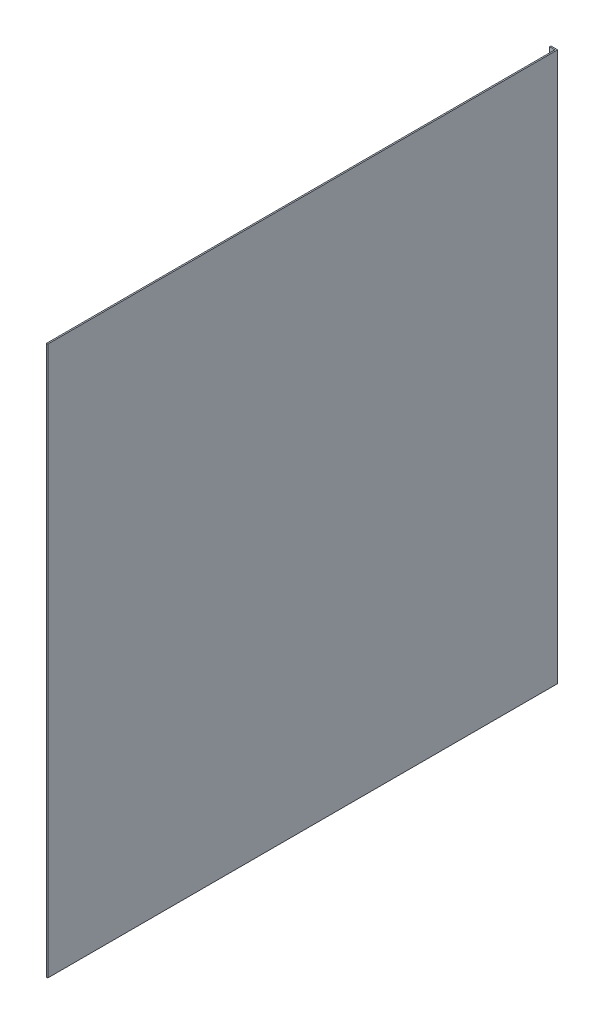
ISO-10303-21;
HEADER;
FILE_DESCRIPTION(('STEP AP214'),'2;1');
FILE_NAME('part.step','',(''),(''),'','','');
FILE_SCHEMA(('AUTOMOTIVE_DESIGN { 1 0 10303 214 1 1 1 1 }'));
ENDSEC;
DATA;
#1=APPLICATION_CONTEXT('core data for automotive mechanical design processes');
#2=APPLICATION_PROTOCOL_DEFINITION('international standard','automotive_design',2000,#1);
#3=PRODUCT_CONTEXT('',#1,'mechanical');
#4=PRODUCT('Part','Part','',(#3));
#5=PRODUCT_RELATED_PRODUCT_CATEGORY('part','',(#4));
#6=PRODUCT_DEFINITION_FORMATION('','',#4);
#7=PRODUCT_DEFINITION_CONTEXT('part definition',#1,'design');
#8=PRODUCT_DEFINITION('design','',#6,#7);
#9=PRODUCT_DEFINITION_SHAPE('','',#8);
#10=(LENGTH_UNIT() NAMED_UNIT(*) SI_UNIT(.MILLI.,.METRE.));
#11=(NAMED_UNIT(*) PLANE_ANGLE_UNIT() SI_UNIT($,.RADIAN.));
#12=(NAMED_UNIT(*) SI_UNIT($,.STERADIAN.) SOLID_ANGLE_UNIT());
#13=UNCERTAINTY_MEASURE_WITH_UNIT(LENGTH_MEASURE(1.E-05),#10,'distance_accuracy_value','');
#14=(GEOMETRIC_REPRESENTATION_CONTEXT(3) GLOBAL_UNCERTAINTY_ASSIGNED_CONTEXT((#13)) GLOBAL_UNIT_ASSIGNED_CONTEXT((#10,
#11,#12)) REPRESENTATION_CONTEXT('',''));
#15=CARTESIAN_POINT('',(0.,0.,0.));
#16=DIRECTION('',(0.,0.,1.));
#17=DIRECTION('',(1.,0.,0.));
#18=AXIS2_PLACEMENT_3D('',#15,#16,#17);
#19=CARTESIAN_POINT('',(560.,1880.,-20.));
#20=DIRECTION('',(-1.,0.,0.));
#21=DIRECTION('',(0.,0.,1.));
#22=AXIS2_PLACEMENT_3D('',#19,#20,#21);
#23=PLANE('',#22);
#24=DIRECTION('',(0.,0.,-1.));
#25=VECTOR('',#24,1.);
#26=CARTESIAN_POINT('',(560.,1040.,-20.));
#27=LINE('',#26,#25);
#28=CARTESIAN_POINT('',(560.,1040.,-20.));
#29=VERTEX_POINT('',#28);
#30=CARTESIAN_POINT('',(560.,1040.,-800.));
#31=VERTEX_POINT('',#30);
#32=EDGE_CURVE('E123',#29,#31,#27,.T.);
#33=ORIENTED_EDGE('',*,*,#32,.T.);
#34=DIRECTION('',(0.,-1.,0.));
#35=VECTOR('',#34,1.);
#36=CARTESIAN_POINT('',(560.,1880.,-800.));
#37=LINE('',#36,#35);
#38=CARTESIAN_POINT('',(560.,1880.,-800.));
#39=VERTEX_POINT('',#38);
#40=EDGE_CURVE('E11',#39,#31,#37,.T.);
#41=ORIENTED_EDGE('',*,*,#40,.F.);
#42=DIRECTION('',(0.,0.,-1.));
#43=VECTOR('',#42,1.);
#44=CARTESIAN_POINT('',(560.,1880.,-20.));
#45=LINE('',#44,#43);
#46=CARTESIAN_POINT('',(560.,1880.,-20.));
#47=VERTEX_POINT('',#46);
#48=EDGE_CURVE('E133',#47,#39,#45,.T.);
#49=ORIENTED_EDGE('',*,*,#48,.F.);
#50=DIRECTION('',(0.,-1.,0.));
#51=VECTOR('',#50,1.);
#52=CARTESIAN_POINT('',(560.,1880.,-20.));
#53=LINE('',#52,#51);
#54=EDGE_CURVE('E119',#47,#29,#53,.T.);
#55=ORIENTED_EDGE('',*,*,#54,.T.);
#56=EDGE_LOOP('',(#33,#41,#49,#55));
#57=FACE_BOUND('',#56,.T.);
#58=ADVANCED_FACE('F39',(#57),#23,.F.);
#59=CARTESIAN_POINT('',(560.,1880.,-800.));
#60=DIRECTION('',(0.,0.,1.));
#61=DIRECTION('',(1.,0.,0.));
#62=AXIS2_PLACEMENT_3D('',#59,#60,#61);
#63=PLANE('',#62);
#64=DIRECTION('',(-1.,0.,0.));
#65=VECTOR('',#64,1.);
#66=CARTESIAN_POINT('',(560.,1040.,-800.));
#67=LINE('',#66,#65);
#68=CARTESIAN_POINT('',(550.,1040.,-800.));
#69=VERTEX_POINT('',#68);
#70=EDGE_CURVE('E126',#31,#69,#67,.T.);
#71=ORIENTED_EDGE('',*,*,#70,.T.);
#72=DIRECTION('',(0.,-1.,0.));
#73=VECTOR('',#72,1.);
#74=CARTESIAN_POINT('',(550.,1880.,-800.));
#75=LINE('',#74,#73);
#76=CARTESIAN_POINT('',(550.,1880.,-800.));
#77=VERTEX_POINT('',#76);
#78=EDGE_CURVE('E47',#77,#69,#75,.T.);
#79=ORIENTED_EDGE('',*,*,#78,.F.);
#80=DIRECTION('',(-1.,0.,0.));
#81=VECTOR('',#80,1.);
#82=CARTESIAN_POINT('',(560.,1880.,-800.));
#83=LINE('',#82,#81);
#84=EDGE_CURVE('E92',#39,#77,#83,.T.);
#85=ORIENTED_EDGE('',*,*,#84,.F.);
#86=ORIENTED_EDGE('',*,*,#40,.T.);
#87=EDGE_LOOP('',(#71,#79,#85,#86));
#88=FACE_BOUND('',#87,.T.);
#89=ADVANCED_FACE('F157',(#88),#63,.F.);
#90=CARTESIAN_POINT('',(550.,1880.,-800.));
#91=DIRECTION('',(1.,0.,0.));
#92=DIRECTION('',(0.,0.,-1.));
#93=AXIS2_PLACEMENT_3D('',#90,#91,#92);
#94=PLANE('',#93);
#95=DIRECTION('',(0.,0.,1.));
#96=VECTOR('',#95,1.);
#97=CARTESIAN_POINT('',(550.,1040.,-800.));
#98=LINE('',#97,#96);
#99=CARTESIAN_POINT('',(550.,1040.,-798.));
#100=VERTEX_POINT('',#99);
#101=EDGE_CURVE('E128',#69,#100,#98,.T.);
#102=ORIENTED_EDGE('',*,*,#101,.T.);
#103=DIRECTION('',(0.,-1.,0.));
#104=VECTOR('',#103,1.);
#105=CARTESIAN_POINT('',(550.,1880.,-798.));
#106=LINE('',#105,#104);
#107=CARTESIAN_POINT('',(550.,1880.,-798.));
#108=VERTEX_POINT('',#107);
#109=EDGE_CURVE('E114',#108,#100,#106,.T.);
#110=ORIENTED_EDGE('',*,*,#109,.F.);
#111=DIRECTION('',(0.,0.,1.));
#112=VECTOR('',#111,1.);
#113=CARTESIAN_POINT('',(550.,1880.,-800.));
#114=LINE('',#113,#112);
#115=EDGE_CURVE('E105',#77,#108,#114,.T.);
#116=ORIENTED_EDGE('',*,*,#115,.F.);
#117=ORIENTED_EDGE('',*,*,#78,.T.);
#118=EDGE_LOOP('',(#102,#110,#116,#117));
#119=FACE_BOUND('',#118,.T.);
#120=ADVANCED_FACE('F139',(#119),#94,.F.);
#121=CARTESIAN_POINT('',(550.,1880.,-798.));
#122=DIRECTION('',(0.,0.,-1.));
#123=DIRECTION('',(-1.,0.,0.));
#124=AXIS2_PLACEMENT_3D('',#121,#122,#123);
#125=PLANE('',#124);
#126=DIRECTION('',(1.,0.,0.));
#127=VECTOR('',#126,1.);
#128=CARTESIAN_POINT('',(550.,1040.,-798.));
#129=LINE('',#128,#127);
#130=CARTESIAN_POINT('',(558.,1040.,-798.));
#131=VERTEX_POINT('',#130);
#132=EDGE_CURVE('E113',#100,#131,#129,.T.);
#133=ORIENTED_EDGE('',*,*,#132,.T.);
#134=DIRECTION('',(0.,-1.,0.));
#135=VECTOR('',#134,1.);
#136=CARTESIAN_POINT('',(558.,1880.,-798.));
#137=LINE('',#136,#135);
#138=CARTESIAN_POINT('',(558.,1880.,-798.));
#139=VERTEX_POINT('',#138);
#140=EDGE_CURVE('E110',#139,#131,#137,.T.);
#141=ORIENTED_EDGE('',*,*,#140,.F.);
#142=DIRECTION('',(1.,0.,0.));
#143=VECTOR('',#142,1.);
#144=CARTESIAN_POINT('',(550.,1880.,-798.));
#145=LINE('',#144,#143);
#146=EDGE_CURVE('E99',#108,#139,#145,.T.);
#147=ORIENTED_EDGE('',*,*,#146,.F.);
#148=ORIENTED_EDGE('',*,*,#109,.T.);
#149=EDGE_LOOP('',(#133,#141,#147,#148));
#150=FACE_BOUND('',#149,.T.);
#151=ADVANCED_FACE('F111',(#150),#125,.F.);
#152=CARTESIAN_POINT('',(558.,1880.,-798.));
#153=DIRECTION('',(1.,0.,0.));
#154=DIRECTION('',(0.,0.,-1.));
#155=AXIS2_PLACEMENT_3D('',#152,#153,#154);
#156=PLANE('',#155);
#157=DIRECTION('',(0.,0.,1.));
#158=VECTOR('',#157,1.);
#159=CARTESIAN_POINT('',(558.,1040.,-798.));
#160=LINE('',#159,#158);
#161=CARTESIAN_POINT('',(558.,1040.,-20.));
#162=VERTEX_POINT('',#161);
#163=EDGE_CURVE('E78',#131,#162,#160,.T.);
#164=ORIENTED_EDGE('',*,*,#163,.T.);
#165=DIRECTION('',(0.,-1.,0.));
#166=VECTOR('',#165,1.);
#167=CARTESIAN_POINT('',(558.,1880.,-20.));
#168=LINE('',#167,#166);
#169=CARTESIAN_POINT('',(558.,1880.,-20.));
#170=VERTEX_POINT('',#169);
#171=EDGE_CURVE('E115',#170,#162,#168,.T.);
#172=ORIENTED_EDGE('',*,*,#171,.F.);
#173=DIRECTION('',(0.,0.,1.));
#174=VECTOR('',#173,1.);
#175=CARTESIAN_POINT('',(558.,1880.,-798.));
#176=LINE('',#175,#174);
#177=EDGE_CURVE('E103',#139,#170,#176,.T.);
#178=ORIENTED_EDGE('',*,*,#177,.F.);
#179=ORIENTED_EDGE('',*,*,#140,.T.);
#180=EDGE_LOOP('',(#164,#172,#178,#179));
#181=FACE_BOUND('',#180,.T.);
#182=ADVANCED_FACE('F117',(#181),#156,.F.);
#183=CARTESIAN_POINT('',(558.,1880.,-20.));
#184=DIRECTION('',(0.,0.,-1.));
#185=DIRECTION('',(-1.,0.,0.));
#186=AXIS2_PLACEMENT_3D('',#183,#184,#185);
#187=PLANE('',#186);
#188=DIRECTION('',(1.,0.,0.));
#189=VECTOR('',#188,1.);
#190=CARTESIAN_POINT('',(558.,1040.,-20.));
#191=LINE('',#190,#189);
#192=EDGE_CURVE('E84',#162,#29,#191,.T.);
#193=ORIENTED_EDGE('',*,*,#192,.T.);
#194=ORIENTED_EDGE('',*,*,#54,.F.);
#195=DIRECTION('',(1.,0.,0.));
#196=VECTOR('',#195,1.);
#197=CARTESIAN_POINT('',(558.,1880.,-20.));
#198=LINE('',#197,#196);
#199=EDGE_CURVE('E55',#170,#47,#198,.T.);
#200=ORIENTED_EDGE('',*,*,#199,.F.);
#201=ORIENTED_EDGE('',*,*,#171,.T.);
#202=EDGE_LOOP('',(#193,#194,#200,#201));
#203=FACE_BOUND('',#202,.T.);
#204=ADVANCED_FACE('F146',(#203),#187,.F.);
#205=CARTESIAN_POINT('',(0.,1880.,0.));
#206=DIRECTION('',(0.,1.,0.));
#207=DIRECTION('',(0.,0.,1.));
#208=AXIS2_PLACEMENT_3D('',#205,#206,#207);
#209=PLANE('',#208);
#210=ORIENTED_EDGE('',*,*,#48,.T.);
#211=ORIENTED_EDGE('',*,*,#84,.T.);
#212=ORIENTED_EDGE('',*,*,#115,.T.);
#213=ORIENTED_EDGE('',*,*,#146,.T.);
#214=ORIENTED_EDGE('',*,*,#177,.T.);
#215=ORIENTED_EDGE('',*,*,#199,.T.);
#216=EDGE_LOOP('',(#210,#211,#212,#213,#214,#215));
#217=FACE_BOUND('',#216,.T.);
#218=ADVANCED_FACE('F101',(#217),#209,.T.);
#219=CARTESIAN_POINT('',(0.,1040.,0.));
#220=DIRECTION('',(0.,1.,0.));
#221=DIRECTION('',(0.,0.,1.));
#222=AXIS2_PLACEMENT_3D('',#219,#220,#221);
#223=PLANE('',#222);
#224=ORIENTED_EDGE('',*,*,#32,.F.);
#225=ORIENTED_EDGE('',*,*,#192,.F.);
#226=ORIENTED_EDGE('',*,*,#163,.F.);
#227=ORIENTED_EDGE('',*,*,#132,.F.);
#228=ORIENTED_EDGE('',*,*,#101,.F.);
#229=ORIENTED_EDGE('',*,*,#70,.F.);
#230=EDGE_LOOP('',(#224,#225,#226,#227,#228,#229));
#231=FACE_BOUND('',#230,.T.);
#232=ADVANCED_FACE('F142',(#231),#223,.F.);
#233=CLOSED_SHELL('',(#58,#89,#120,#151,#182,#204,#218,#232));
#234=MANIFOLD_SOLID_BREP('B2',#233);
#235=ADVANCED_BREP_SHAPE_REPRESENTATION('',(#18,#234),#14);
#236=SHAPE_DEFINITION_REPRESENTATION(#9,#235);
ENDSEC;
END-ISO-10303-21;
